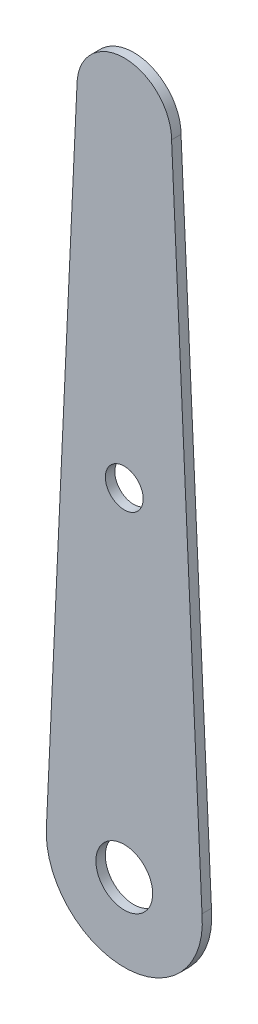
ISO-10303-21;
HEADER;
FILE_DESCRIPTION(('STEP AP214'),'2;1');
FILE_NAME('part.step','',(''),(''),'','','');
FILE_SCHEMA(('AUTOMOTIVE_DESIGN { 1 0 10303 214 1 1 1 1 }'));
ENDSEC;
DATA;
#1=APPLICATION_CONTEXT('core data for automotive mechanical design processes');
#2=APPLICATION_PROTOCOL_DEFINITION('international standard','automotive_design',2000,#1);
#3=PRODUCT_CONTEXT('',#1,'mechanical');
#4=PRODUCT('Part','Part','',(#3));
#5=PRODUCT_RELATED_PRODUCT_CATEGORY('part','',(#4));
#6=PRODUCT_DEFINITION_FORMATION('','',#4);
#7=PRODUCT_DEFINITION_CONTEXT('part definition',#1,'design');
#8=PRODUCT_DEFINITION('design','',#6,#7);
#9=PRODUCT_DEFINITION_SHAPE('','',#8);
#10=(LENGTH_UNIT() NAMED_UNIT(*) SI_UNIT(.MILLI.,.METRE.));
#11=(NAMED_UNIT(*) PLANE_ANGLE_UNIT() SI_UNIT($,.RADIAN.));
#12=(NAMED_UNIT(*) SI_UNIT($,.STERADIAN.) SOLID_ANGLE_UNIT());
#13=UNCERTAINTY_MEASURE_WITH_UNIT(LENGTH_MEASURE(1.E-05),#10,'distance_accuracy_value','');
#14=(GEOMETRIC_REPRESENTATION_CONTEXT(3) GLOBAL_UNCERTAINTY_ASSIGNED_CONTEXT((#13)) GLOBAL_UNIT_ASSIGNED_CONTEXT((#10,
#11,#12)) REPRESENTATION_CONTEXT('',''));
#15=CARTESIAN_POINT('',(0.,0.,0.));
#16=DIRECTION('',(0.,0.,1.));
#17=DIRECTION('',(1.,0.,0.));
#18=AXIS2_PLACEMENT_3D('',#15,#16,#17);
#19=CARTESIAN_POINT('',(0.,108.982872222153,2.));
#20=DIRECTION('',(0.,0.,1.));
#21=DIRECTION('',(1.,0.,0.));
#22=AXIS2_PLACEMENT_3D('',#19,#20,#21);
#23=PLANE('',#22);
#24=CARTESIAN_POINT('',(0.,-31.0171277778465,2.));
#25=DIRECTION('',(0.,0.,1.));
#26=DIRECTION('',(1.,0.,0.));
#27=AXIS2_PLACEMENT_3D('',#24,#25,#26);
#28=CIRCLE('',#27,6.);
#29=CARTESIAN_POINT('',(6.,-31.0171277778465,2.));
#30=VERTEX_POINT('',#29);
#31=EDGE_CURVE('E114',#30,#30,#28,.T.);
#32=ORIENTED_EDGE('',*,*,#31,.F.);
#33=EDGE_LOOP('',(#32));
#34=FACE_BOUND('',#33,.T.);
#35=CARTESIAN_POINT('',(0.,108.982872222153,2.));
#36=DIRECTION('',(0.,0.,1.));
#37=DIRECTION('',(1.,0.,0.));
#38=AXIS2_PLACEMENT_3D('',#35,#36,#37);
#39=CIRCLE('',#38,10.);
#40=CARTESIAN_POINT('',(10.,108.982872222153,2.));
#41=VERTEX_POINT('',#40);
#42=CARTESIAN_POINT('',(-10.,108.982872222153,2.));
#43=VERTEX_POINT('',#42);
#44=EDGE_CURVE('E84',#41,#43,#39,.T.);
#45=ORIENTED_EDGE('',*,*,#44,.T.);
#46=DIRECTION('',(-0.0463786111867173,-0.998923933252373,0.));
#47=VECTOR('',#46,1.);
#48=CARTESIAN_POINT('',(-16.4290178060049,-29.4882805225678,2.));
#49=LINE('',#48,#47);
#50=CARTESIAN_POINT('',(-16.4290178060049,-29.4882805225678,2.));
#51=VERTEX_POINT('',#50);
#52=EDGE_CURVE('E79',#43,#51,#49,.T.);
#53=ORIENTED_EDGE('',*,*,#52,.T.);
#54=CARTESIAN_POINT('',(0.,-31.0171277778465,2.));
#55=DIRECTION('',(0.,0.,1.));
#56=DIRECTION('',(1.,0.,0.));
#57=AXIS2_PLACEMENT_3D('',#54,#55,#56);
#58=CIRCLE('',#57,16.5);
#59=CARTESIAN_POINT('',(16.4290178060049,-29.4882805225678,2.));
#60=VERTEX_POINT('',#59);
#61=EDGE_CURVE('E82',#51,#60,#58,.T.);
#62=ORIENTED_EDGE('',*,*,#61,.T.);
#63=DIRECTION('',(-0.0463786111867173,0.998923933252373,0.));
#64=VECTOR('',#63,1.);
#65=CARTESIAN_POINT('',(10.,108.982872222153,2.));
#66=LINE('',#65,#64);
#67=EDGE_CURVE('E49',#60,#41,#66,.T.);
#68=ORIENTED_EDGE('',*,*,#67,.T.);
#69=EDGE_LOOP('',(#45,#53,#62,#68));
#70=FACE_BOUND('',#69,.T.);
#71=CARTESIAN_POINT('',(0.,40.2428722221535,2.));
#72=DIRECTION('',(0.,0.,1.));
#73=DIRECTION('',(1.,0.,0.));
#74=AXIS2_PLACEMENT_3D('',#71,#72,#73);
#75=CIRCLE('',#74,4.);
#76=CARTESIAN_POINT('',(4.,40.2428722221535,2.));
#77=VERTEX_POINT('',#76);
#78=EDGE_CURVE('E99',#77,#77,#75,.T.);
#79=ORIENTED_EDGE('',*,*,#78,.F.);
#80=EDGE_LOOP('',(#79));
#81=FACE_BOUND('',#80,.T.);
#82=ADVANCED_FACE('F32',(#34,#70,#81),#23,.T.);
#83=CARTESIAN_POINT('',(0.,108.982872222153,0.));
#84=DIRECTION('',(0.,0.,1.));
#85=DIRECTION('',(1.,0.,0.));
#86=AXIS2_PLACEMENT_3D('',#83,#84,#85);
#87=PLANE('',#86);
#88=CARTESIAN_POINT('',(0.,-31.0171277778465,0.));
#89=DIRECTION('',(0.,0.,1.));
#90=DIRECTION('',(1.,0.,0.));
#91=AXIS2_PLACEMENT_3D('',#88,#89,#90);
#92=CIRCLE('',#91,6.);
#93=CARTESIAN_POINT('',(6.,-31.0171277778465,0.));
#94=VERTEX_POINT('',#93);
#95=EDGE_CURVE('E119',#94,#94,#92,.T.);
#96=ORIENTED_EDGE('',*,*,#95,.T.);
#97=EDGE_LOOP('',(#96));
#98=FACE_BOUND('',#97,.T.);
#99=CARTESIAN_POINT('',(0.,108.982872222153,0.));
#100=DIRECTION('',(0.,0.,1.));
#101=DIRECTION('',(1.,0.,0.));
#102=AXIS2_PLACEMENT_3D('',#99,#100,#101);
#103=CIRCLE('',#102,10.);
#104=CARTESIAN_POINT('',(10.,108.982872222153,0.));
#105=VERTEX_POINT('',#104);
#106=CARTESIAN_POINT('',(-10.,108.982872222153,0.));
#107=VERTEX_POINT('',#106);
#108=EDGE_CURVE('E96',#105,#107,#103,.T.);
#109=ORIENTED_EDGE('',*,*,#108,.F.);
#110=DIRECTION('',(-0.0463786111867173,0.998923933252373,0.));
#111=VECTOR('',#110,1.);
#112=CARTESIAN_POINT('',(10.,108.982872222153,0.));
#113=LINE('',#112,#111);
#114=CARTESIAN_POINT('',(16.4290178060049,-29.4882805225678,0.));
#115=VERTEX_POINT('',#114);
#116=EDGE_CURVE('E72',#115,#105,#113,.T.);
#117=ORIENTED_EDGE('',*,*,#116,.F.);
#118=CARTESIAN_POINT('',(0.,-31.0171277778465,0.));
#119=DIRECTION('',(0.,0.,1.));
#120=DIRECTION('',(1.,0.,0.));
#121=AXIS2_PLACEMENT_3D('',#118,#119,#120);
#122=CIRCLE('',#121,16.5);
#123=CARTESIAN_POINT('',(-16.4290178060049,-29.4882805225678,0.));
#124=VERTEX_POINT('',#123);
#125=EDGE_CURVE('E66',#124,#115,#122,.T.);
#126=ORIENTED_EDGE('',*,*,#125,.F.);
#127=DIRECTION('',(-0.0463786111867173,-0.998923933252373,0.));
#128=VECTOR('',#127,1.);
#129=CARTESIAN_POINT('',(-16.4290178060049,-29.4882805225678,0.));
#130=LINE('',#129,#128);
#131=EDGE_CURVE('E88',#107,#124,#130,.T.);
#132=ORIENTED_EDGE('',*,*,#131,.F.);
#133=EDGE_LOOP('',(#109,#117,#126,#132));
#134=FACE_BOUND('',#133,.T.);
#135=CARTESIAN_POINT('',(0.,40.2428722221535,0.));
#136=DIRECTION('',(0.,0.,1.));
#137=DIRECTION('',(1.,0.,0.));
#138=AXIS2_PLACEMENT_3D('',#135,#136,#137);
#139=CIRCLE('',#138,4.);
#140=CARTESIAN_POINT('',(4.,40.2428722221535,0.));
#141=VERTEX_POINT('',#140);
#142=EDGE_CURVE('E111',#141,#141,#139,.T.);
#143=ORIENTED_EDGE('',*,*,#142,.T.);
#144=EDGE_LOOP('',(#143));
#145=FACE_BOUND('',#144,.T.);
#146=ADVANCED_FACE('F107',(#98,#134,#145),#87,.F.);
#147=CARTESIAN_POINT('',(0.,108.982872222153,2.));
#148=DIRECTION('',(0.,0.,-1.));
#149=DIRECTION('',(-1.,0.,0.));
#150=AXIS2_PLACEMENT_3D('',#147,#148,#149);
#151=CYLINDRICAL_SURFACE('',#150,10.);
#152=ORIENTED_EDGE('',*,*,#108,.T.);
#153=DIRECTION('',(0.,0.,-1.));
#154=VECTOR('',#153,1.);
#155=CARTESIAN_POINT('',(-10.,108.982872222153,2.));
#156=LINE('',#155,#154);
#157=EDGE_CURVE('E11',#43,#107,#156,.T.);
#158=ORIENTED_EDGE('',*,*,#157,.F.);
#159=ORIENTED_EDGE('',*,*,#44,.F.);
#160=DIRECTION('',(0.,0.,-1.));
#161=VECTOR('',#160,1.);
#162=CARTESIAN_POINT('',(10.,108.982872222153,2.));
#163=LINE('',#162,#161);
#164=EDGE_CURVE('E92',#41,#105,#163,.T.);
#165=ORIENTED_EDGE('',*,*,#164,.T.);
#166=EDGE_LOOP('',(#152,#158,#159,#165));
#167=FACE_BOUND('',#166,.T.);
#168=ADVANCED_FACE('F34',(#167),#151,.T.);
#169=CARTESIAN_POINT('',(-16.4290178060049,-29.4882805225678,2.));
#170=DIRECTION('',(0.998923933252373,-0.0463786111867173,0.));
#171=DIRECTION('',(0.0463786111867173,0.998923933252373,0.));
#172=AXIS2_PLACEMENT_3D('',#169,#170,#171);
#173=PLANE('',#172);
#174=ORIENTED_EDGE('',*,*,#131,.T.);
#175=DIRECTION('',(0.,0.,-1.));
#176=VECTOR('',#175,1.);
#177=CARTESIAN_POINT('',(-16.4290178060049,-29.4882805225678,2.));
#178=LINE('',#177,#176);
#179=EDGE_CURVE('E41',#51,#124,#178,.T.);
#180=ORIENTED_EDGE('',*,*,#179,.F.);
#181=ORIENTED_EDGE('',*,*,#52,.F.);
#182=ORIENTED_EDGE('',*,*,#157,.T.);
#183=EDGE_LOOP('',(#174,#180,#181,#182));
#184=FACE_BOUND('',#183,.T.);
#185=ADVANCED_FACE('F87',(#184),#173,.F.);
#186=CARTESIAN_POINT('',(0.,-31.0171277778465,2.));
#187=DIRECTION('',(0.,0.,-1.));
#188=DIRECTION('',(-1.,0.,0.));
#189=AXIS2_PLACEMENT_3D('',#186,#187,#188);
#190=CYLINDRICAL_SURFACE('',#189,16.5);
#191=ORIENTED_EDGE('',*,*,#125,.T.);
#192=DIRECTION('',(0.,0.,-1.));
#193=VECTOR('',#192,1.);
#194=CARTESIAN_POINT('',(16.4290178060049,-29.4882805225678,2.));
#195=LINE('',#194,#193);
#196=EDGE_CURVE('E89',#60,#115,#195,.T.);
#197=ORIENTED_EDGE('',*,*,#196,.F.);
#198=ORIENTED_EDGE('',*,*,#61,.F.);
#199=ORIENTED_EDGE('',*,*,#179,.T.);
#200=EDGE_LOOP('',(#191,#197,#198,#199));
#201=FACE_BOUND('',#200,.T.);
#202=ADVANCED_FACE('F90',(#201),#190,.T.);
#203=CARTESIAN_POINT('',(10.,108.982872222153,2.));
#204=DIRECTION('',(-0.998923933252373,-0.0463786111867173,0.));
#205=DIRECTION('',(0.0463786111867173,-0.998923933252373,0.));
#206=AXIS2_PLACEMENT_3D('',#203,#204,#205);
#207=PLANE('',#206);
#208=ORIENTED_EDGE('',*,*,#116,.T.);
#209=ORIENTED_EDGE('',*,*,#164,.F.);
#210=ORIENTED_EDGE('',*,*,#67,.F.);
#211=ORIENTED_EDGE('',*,*,#196,.T.);
#212=EDGE_LOOP('',(#208,#209,#210,#211));
#213=FACE_BOUND('',#212,.T.);
#214=ADVANCED_FACE('F104',(#213),#207,.F.);
#215=CARTESIAN_POINT('',(0.,40.2428722221535,2.));
#216=DIRECTION('',(0.,0.,-1.));
#217=DIRECTION('',(-1.,0.,0.));
#218=AXIS2_PLACEMENT_3D('',#215,#216,#217);
#219=CYLINDRICAL_SURFACE('',#218,4.);
#220=ORIENTED_EDGE('',*,*,#78,.T.);
#221=EDGE_LOOP('',(#220));
#222=FACE_BOUND('',#221,.T.);
#223=ORIENTED_EDGE('',*,*,#142,.F.);
#224=EDGE_LOOP('',(#223));
#225=FACE_BOUND('',#224,.T.);
#226=ADVANCED_FACE('F126',(#222,#225),#219,.F.);
#227=CARTESIAN_POINT('',(0.,-31.0171277778465,0.));
#228=DIRECTION('',(0.,0.,1.));
#229=DIRECTION('',(1.,0.,0.));
#230=AXIS2_PLACEMENT_3D('',#227,#228,#229);
#231=CYLINDRICAL_SURFACE('',#230,6.);
#232=ORIENTED_EDGE('',*,*,#31,.T.);
#233=EDGE_LOOP('',(#232));
#234=FACE_BOUND('',#233,.T.);
#235=ORIENTED_EDGE('',*,*,#95,.F.);
#236=EDGE_LOOP('',(#235));
#237=FACE_BOUND('',#236,.T.);
#238=ADVANCED_FACE('F124',(#234,#237),#231,.F.);
#239=CLOSED_SHELL('',(#82,#146,#168,#185,#202,#214,#226,#238));
#240=MANIFOLD_SOLID_BREP('B2',#239);
#241=ADVANCED_BREP_SHAPE_REPRESENTATION('',(#18,#240),#14);
#242=SHAPE_DEFINITION_REPRESENTATION(#9,#241);
ENDSEC;
END-ISO-10303-21;
